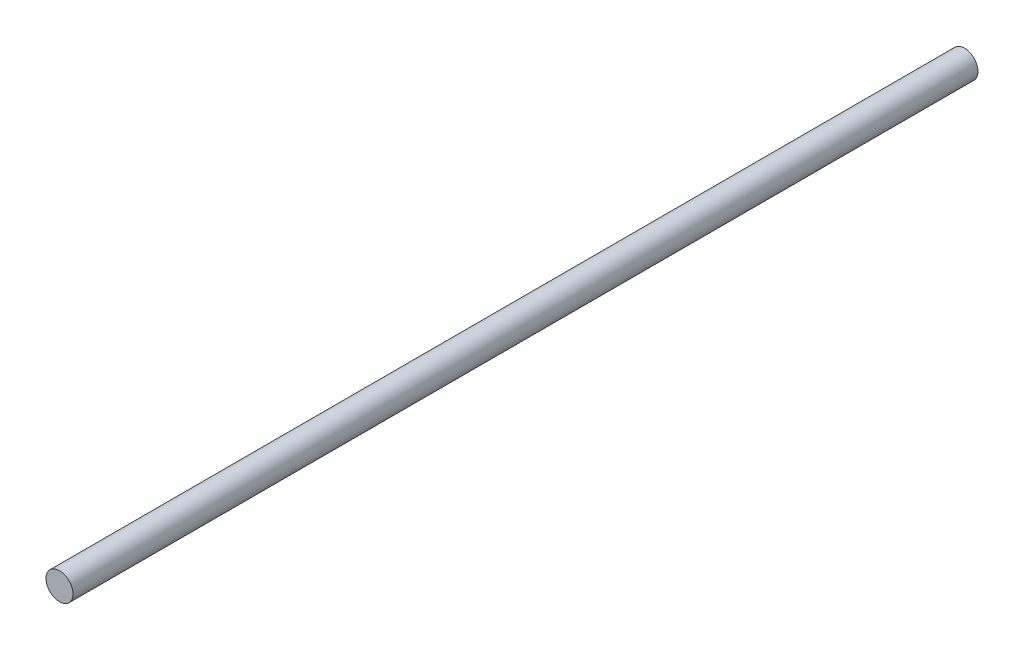
ISO-10303-21;
HEADER;
FILE_DESCRIPTION(('STEP AP214'),'2;1');
FILE_NAME('part.step','',(''),(''),'','','');
FILE_SCHEMA(('AUTOMOTIVE_DESIGN { 1 0 10303 214 1 1 1 1 }'));
ENDSEC;
DATA;
#1=APPLICATION_CONTEXT('core data for automotive mechanical design processes');
#2=APPLICATION_PROTOCOL_DEFINITION('international standard','automotive_design',2000,#1);
#3=PRODUCT_CONTEXT('',#1,'mechanical');
#4=PRODUCT('Part','Part','',(#3));
#5=PRODUCT_RELATED_PRODUCT_CATEGORY('part','',(#4));
#6=PRODUCT_DEFINITION_FORMATION('','',#4);
#7=PRODUCT_DEFINITION_CONTEXT('part definition',#1,'design');
#8=PRODUCT_DEFINITION('design','',#6,#7);
#9=PRODUCT_DEFINITION_SHAPE('','',#8);
#10=(LENGTH_UNIT() NAMED_UNIT(*) SI_UNIT(.MILLI.,.METRE.));
#11=(NAMED_UNIT(*) PLANE_ANGLE_UNIT() SI_UNIT($,.RADIAN.));
#12=(NAMED_UNIT(*) SI_UNIT($,.STERADIAN.) SOLID_ANGLE_UNIT());
#13=UNCERTAINTY_MEASURE_WITH_UNIT(LENGTH_MEASURE(1.E-05),#10,'distance_accuracy_value','');
#14=(GEOMETRIC_REPRESENTATION_CONTEXT(3) GLOBAL_UNCERTAINTY_ASSIGNED_CONTEXT((#13)) GLOBAL_UNIT_ASSIGNED_CONTEXT((#10,
#11,#12)) REPRESENTATION_CONTEXT('',''));
#15=CARTESIAN_POINT('',(0.,0.,0.));
#16=DIRECTION('',(0.,0.,1.));
#17=DIRECTION('',(1.,0.,0.));
#18=AXIS2_PLACEMENT_3D('',#15,#16,#17);
#19=CARTESIAN_POINT('',(0.,0.,335.));
#20=DIRECTION('',(0.,0.,-1.));
#21=DIRECTION('',(-1.,0.,0.));
#22=AXIS2_PLACEMENT_3D('',#19,#20,#21);
#23=CYLINDRICAL_SURFACE('',#22,5.);
#24=CARTESIAN_POINT('',(0.,0.,335.));
#25=DIRECTION('',(0.,0.,1.));
#26=DIRECTION('',(1.,0.,0.));
#27=AXIS2_PLACEMENT_3D('',#24,#25,#26);
#28=CIRCLE('',#27,5.);
#29=CARTESIAN_POINT('',(5.,0.,335.));
#30=VERTEX_POINT('',#29);
#31=EDGE_CURVE('E10',#30,#30,#28,.T.);
#32=ORIENTED_EDGE('',*,*,#31,.F.);
#33=EDGE_LOOP('',(#32));
#34=FACE_BOUND('',#33,.T.);
#35=CARTESIAN_POINT('',(0.,0.,0.));
#36=DIRECTION('',(0.,0.,1.));
#37=DIRECTION('',(1.,0.,0.));
#38=AXIS2_PLACEMENT_3D('',#35,#36,#37);
#39=CIRCLE('',#38,5.);
#40=CARTESIAN_POINT('',(5.,0.,0.));
#41=VERTEX_POINT('',#40);
#42=EDGE_CURVE('E38',#41,#41,#39,.T.);
#43=ORIENTED_EDGE('',*,*,#42,.T.);
#44=EDGE_LOOP('',(#43));
#45=FACE_BOUND('',#44,.T.);
#46=ADVANCED_FACE('F35',(#34,#45),#23,.T.);
#47=CARTESIAN_POINT('',(0.,0.,335.));
#48=DIRECTION('',(0.,0.,1.));
#49=DIRECTION('',(1.,0.,0.));
#50=AXIS2_PLACEMENT_3D('',#47,#48,#49);
#51=PLANE('',#50);
#52=ORIENTED_EDGE('',*,*,#31,.T.);
#53=EDGE_LOOP('',(#52));
#54=FACE_BOUND('',#53,.T.);
#55=ADVANCED_FACE('F50',(#54),#51,.T.);
#56=CARTESIAN_POINT('',(0.,0.,0.));
#57=DIRECTION('',(0.,0.,1.));
#58=DIRECTION('',(1.,0.,0.));
#59=AXIS2_PLACEMENT_3D('',#56,#57,#58);
#60=PLANE('',#59);
#61=ORIENTED_EDGE('',*,*,#42,.F.);
#62=EDGE_LOOP('',(#61));
#63=FACE_BOUND('',#62,.T.);
#64=ADVANCED_FACE('F48',(#63),#60,.F.);
#65=CLOSED_SHELL('',(#46,#55,#64));
#66=MANIFOLD_SOLID_BREP('B2',#65);
#67=ADVANCED_BREP_SHAPE_REPRESENTATION('',(#18,#66),#14);
#68=SHAPE_DEFINITION_REPRESENTATION(#9,#67);
ENDSEC;
END-ISO-10303-21;
